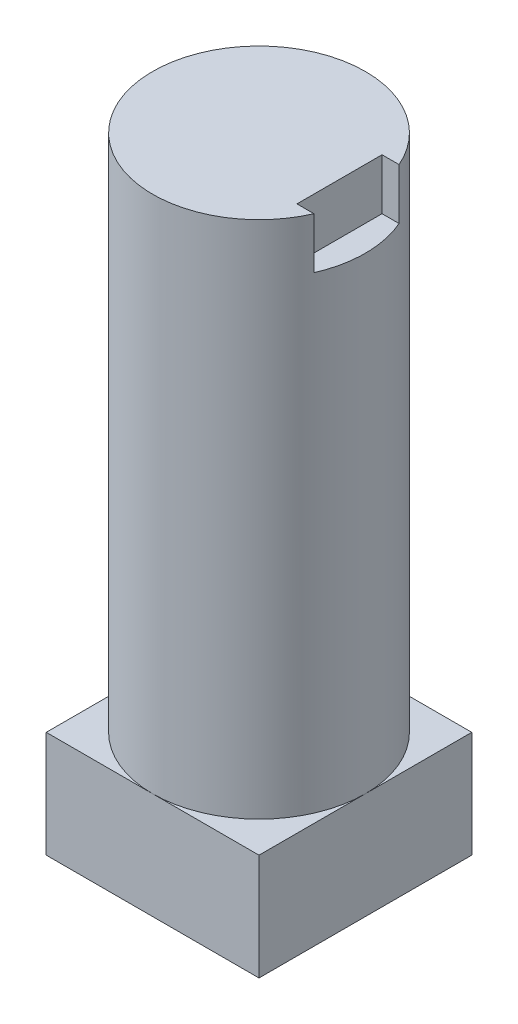
ISO-10303-21;
HEADER;
FILE_DESCRIPTION(('STEP AP214'),'2;1');
FILE_NAME('part.step','',(''),(''),'','','');
FILE_SCHEMA(('AUTOMOTIVE_DESIGN { 1 0 10303 214 1 1 1 1 }'));
ENDSEC;
DATA;
#1=APPLICATION_CONTEXT('core data for automotive mechanical design processes');
#2=APPLICATION_PROTOCOL_DEFINITION('international standard','automotive_design',2000,#1);
#3=PRODUCT_CONTEXT('',#1,'mechanical');
#4=PRODUCT('Part','Part','',(#3));
#5=PRODUCT_RELATED_PRODUCT_CATEGORY('part','',(#4));
#6=PRODUCT_DEFINITION_FORMATION('','',#4);
#7=PRODUCT_DEFINITION_CONTEXT('part definition',#1,'design');
#8=PRODUCT_DEFINITION('design','',#6,#7);
#9=PRODUCT_DEFINITION_SHAPE('','',#8);
#10=(LENGTH_UNIT() NAMED_UNIT(*) SI_UNIT(.MILLI.,.METRE.));
#11=(NAMED_UNIT(*) PLANE_ANGLE_UNIT() SI_UNIT($,.RADIAN.));
#12=(NAMED_UNIT(*) SI_UNIT($,.STERADIAN.) SOLID_ANGLE_UNIT());
#13=UNCERTAINTY_MEASURE_WITH_UNIT(LENGTH_MEASURE(1.E-05),#10,'distance_accuracy_value','');
#14=(GEOMETRIC_REPRESENTATION_CONTEXT(3) GLOBAL_UNCERTAINTY_ASSIGNED_CONTEXT((#13)) GLOBAL_UNIT_ASSIGNED_CONTEXT((#10,
#11,#12)) REPRESENTATION_CONTEXT('',''));
#15=CARTESIAN_POINT('',(0.,0.,0.));
#16=DIRECTION('',(0.,0.,1.));
#17=DIRECTION('',(1.,0.,0.));
#18=AXIS2_PLACEMENT_3D('',#15,#16,#17);
#19=CARTESIAN_POINT('',(-34.9241184124081,14.312388078501,22.3609994216903));
#20=DIRECTION('',(0.,-1.,0.));
#21=DIRECTION('',(0.,0.,-1.));
#22=AXIS2_PLACEMENT_3D('',#19,#20,#21);
#23=CYLINDRICAL_SURFACE('',#22,2.5);
#24=CARTESIAN_POINT('',(-34.9241184124081,-3.28761192149899,22.3609994216903));
#25=DIRECTION('',(0.,1.,0.));
#26=DIRECTION('',(0.,0.,1.));
#27=AXIS2_PLACEMENT_3D('',#24,#25,#26);
#28=CIRCLE('',#27,2.5);
#29=CARTESIAN_POINT('',(-34.9241184124081,-3.28761192149899,24.8609994216903));
#30=VERTEX_POINT('',#29);
#31=CARTESIAN_POINT('',(-32.4241184124081,-3.28761192149899,22.3609994216903));
#32=VERTEX_POINT('',#31);
#33=EDGE_CURVE('E144',#30,#32,#28,.T.);
#34=ORIENTED_EDGE('',*,*,#33,.T.);
#35=CARTESIAN_POINT('',(-34.9241184124081,-3.28761192149899,19.8609994216903));
#36=VERTEX_POINT('',#35);
#37=EDGE_CURVE('E52',#32,#36,#28,.T.);
#38=ORIENTED_EDGE('',*,*,#37,.T.);
#39=CARTESIAN_POINT('',(-37.4241184124081,-3.28761192149899,22.3609994216903));
#40=VERTEX_POINT('',#39);
#41=EDGE_CURVE('E184',#36,#40,#28,.T.);
#42=ORIENTED_EDGE('',*,*,#41,.T.);
#43=EDGE_CURVE('E66',#40,#30,#28,.T.);
#44=ORIENTED_EDGE('',*,*,#43,.T.);
#45=EDGE_LOOP('',(#34,#38,#42,#44));
#46=FACE_BOUND('',#45,.T.);
#47=CARTESIAN_POINT('',(-34.9241184124081,8.91238807850102,22.3609994216903));
#48=DIRECTION('',(0.,1.,0.));
#49=DIRECTION('',(0.,0.,1.));
#50=AXIS2_PLACEMENT_3D('',#47,#48,#49);
#51=CIRCLE('',#50,2.5);
#52=CARTESIAN_POINT('',(-32.6328305649302,8.91238807850102,23.3609994216903));
#53=VERTEX_POINT('',#52);
#54=CARTESIAN_POINT('',(-32.6328305649302,8.91238807850102,21.3609994216903));
#55=VERTEX_POINT('',#54);
#56=EDGE_CURVE('E120',#53,#55,#51,.F.);
#57=ORIENTED_EDGE('',*,*,#56,.T.);
#58=DIRECTION('',(0.,1.,0.));
#59=VECTOR('',#58,1.);
#60=CARTESIAN_POINT('',(-32.6328305649302,7.71238807850101,21.3609994216903));
#61=LINE('',#60,#59);
#62=CARTESIAN_POINT('',(-32.6328305649302,7.71238807850101,21.3609994216903));
#63=VERTEX_POINT('',#62);
#64=EDGE_CURVE('E129',#63,#55,#61,.T.);
#65=ORIENTED_EDGE('',*,*,#64,.F.);
#66=CARTESIAN_POINT('',(-34.9241184124081,7.71238807850101,22.3609994216903));
#67=DIRECTION('',(0.,1.,0.));
#68=DIRECTION('',(0.,0.,1.));
#69=AXIS2_PLACEMENT_3D('',#66,#67,#68);
#70=CIRCLE('',#69,2.5);
#71=CARTESIAN_POINT('',(-32.6328305649302,7.71238807850101,23.3609994216903));
#72=VERTEX_POINT('',#71);
#73=EDGE_CURVE('E375',#72,#63,#70,.T.);
#74=ORIENTED_EDGE('',*,*,#73,.F.);
#75=DIRECTION('',(0.,1.,0.));
#76=VECTOR('',#75,1.);
#77=CARTESIAN_POINT('',(-32.6328305649302,7.71238807850101,23.3609994216903));
#78=LINE('',#77,#76);
#79=EDGE_CURVE('E130',#72,#53,#78,.T.);
#80=ORIENTED_EDGE('',*,*,#79,.T.);
#81=EDGE_LOOP('',(#57,#65,#74,#80));
#82=FACE_BOUND('',#81,.T.);
#83=ADVANCED_FACE('F44',(#46,#82),#23,.T.);
#84=CARTESIAN_POINT('',(-30.3076921273144,7.71238807850101,23.3609994216903));
#85=DIRECTION('',(0.,0.,-1.));
#86=DIRECTION('',(-1.,0.,0.));
#87=AXIS2_PLACEMENT_3D('',#84,#85,#86);
#88=PLANE('',#87);
#89=DIRECTION('',(0.,1.,0.));
#90=VECTOR('',#89,1.);
#91=CARTESIAN_POINT('',(-33.0328305649302,7.71238807850101,23.3609994216903));
#92=LINE('',#91,#90);
#93=CARTESIAN_POINT('',(-33.0328305649302,7.71238807850101,23.3609994216903));
#94=VERTEX_POINT('',#93);
#95=CARTESIAN_POINT('',(-33.0328305649302,8.91238807850101,23.3609994216903));
#96=VERTEX_POINT('',#95);
#97=EDGE_CURVE('E138',#94,#96,#92,.T.);
#98=ORIENTED_EDGE('',*,*,#97,.T.);
#99=DIRECTION('',(1.,0.,0.));
#100=VECTOR('',#99,1.);
#101=CARTESIAN_POINT('',(-30.3076921273144,8.91238807850101,23.3609994216903));
#102=LINE('',#101,#100);
#103=EDGE_CURVE('E379',#96,#53,#102,.T.);
#104=ORIENTED_EDGE('',*,*,#103,.T.);
#105=ORIENTED_EDGE('',*,*,#79,.F.);
#106=DIRECTION('',(-1.,0.,0.));
#107=VECTOR('',#106,1.);
#108=CARTESIAN_POINT('',(-30.3076921273144,7.71238807850101,23.3609994216903));
#109=LINE('',#108,#107);
#110=EDGE_CURVE('E374',#72,#94,#109,.T.);
#111=ORIENTED_EDGE('',*,*,#110,.T.);
#112=EDGE_LOOP('',(#98,#104,#105,#111));
#113=FACE_BOUND('',#112,.T.);
#114=ADVANCED_FACE('F228',(#113),#88,.T.);
#115=CARTESIAN_POINT('',(-33.0328305649302,7.71238807850101,7.79325973955173));
#116=DIRECTION('',(-1.,0.,0.));
#117=DIRECTION('',(0.,0.,1.));
#118=AXIS2_PLACEMENT_3D('',#115,#116,#117);
#119=PLANE('',#118);
#120=DIRECTION('',(0.,0.,-1.));
#121=VECTOR('',#120,1.);
#122=CARTESIAN_POINT('',(-33.0328305649302,8.91238807850101,7.79325973955173));
#123=LINE('',#122,#121);
#124=CARTESIAN_POINT('',(-33.0328305649302,8.91238807850101,21.3609994216903));
#125=VERTEX_POINT('',#124);
#126=EDGE_CURVE('E58',#96,#125,#123,.T.);
#127=ORIENTED_EDGE('',*,*,#126,.F.);
#128=ORIENTED_EDGE('',*,*,#97,.F.);
#129=DIRECTION('',(0.,0.,1.));
#130=VECTOR('',#129,1.);
#131=CARTESIAN_POINT('',(-33.0328305649302,7.71238807850101,7.79325973955173));
#132=LINE('',#131,#130);
#133=CARTESIAN_POINT('',(-33.0328305649302,7.71238807850101,21.3609994216903));
#134=VERTEX_POINT('',#133);
#135=EDGE_CURVE('E140',#134,#94,#132,.T.);
#136=ORIENTED_EDGE('',*,*,#135,.F.);
#137=DIRECTION('',(0.,1.,0.));
#138=VECTOR('',#137,1.);
#139=CARTESIAN_POINT('',(-33.0328305649302,7.71238807850101,21.3609994216903));
#140=LINE('',#139,#138);
#141=EDGE_CURVE('E136',#134,#125,#140,.T.);
#142=ORIENTED_EDGE('',*,*,#141,.T.);
#143=EDGE_LOOP('',(#127,#128,#136,#142));
#144=FACE_BOUND('',#143,.T.);
#145=ADVANCED_FACE('F232',(#144),#119,.F.);
#146=CARTESIAN_POINT('',(-30.3076921273144,7.71238807850101,21.3609994216903));
#147=DIRECTION('',(0.,0.,-1.));
#148=DIRECTION('',(-1.,0.,0.));
#149=AXIS2_PLACEMENT_3D('',#146,#147,#148);
#150=PLANE('',#149);
#151=DIRECTION('',(1.,0.,0.));
#152=VECTOR('',#151,1.);
#153=CARTESIAN_POINT('',(-30.3076921273144,8.91238807850101,21.3609994216903));
#154=LINE('',#153,#152);
#155=EDGE_CURVE('E13',#125,#55,#154,.T.);
#156=ORIENTED_EDGE('',*,*,#155,.F.);
#157=ORIENTED_EDGE('',*,*,#141,.F.);
#158=DIRECTION('',(-1.,0.,0.));
#159=VECTOR('',#158,1.);
#160=CARTESIAN_POINT('',(-30.3076921273144,7.71238807850101,21.3609994216903));
#161=LINE('',#160,#159);
#162=EDGE_CURVE('E134',#63,#134,#161,.T.);
#163=ORIENTED_EDGE('',*,*,#162,.F.);
#164=ORIENTED_EDGE('',*,*,#64,.T.);
#165=EDGE_LOOP('',(#156,#157,#163,#164));
#166=FACE_BOUND('',#165,.T.);
#167=ADVANCED_FACE('F132',(#166),#150,.F.);
#168=CARTESIAN_POINT('',(-34.9241184124081,-3.28761192149899,22.3609994216903));
#169=DIRECTION('',(0.,1.,0.));
#170=DIRECTION('',(0.,0.,1.));
#171=AXIS2_PLACEMENT_3D('',#168,#169,#170);
#172=PLANE('',#171);
#173=ORIENTED_EDGE('',*,*,#33,.F.);
#174=DIRECTION('',(1.,0.,0.));
#175=VECTOR('',#174,1.);
#176=CARTESIAN_POINT('',(-37.4241184124081,-3.28761192149899,24.8609994216903));
#177=LINE('',#176,#175);
#178=CARTESIAN_POINT('',(-32.4241184124081,-3.28761192149899,24.8609994216903));
#179=VERTEX_POINT('',#178);
#180=EDGE_CURVE('E151',#30,#179,#177,.T.);
#181=ORIENTED_EDGE('',*,*,#180,.T.);
#182=DIRECTION('',(0.,0.,-1.));
#183=VECTOR('',#182,1.);
#184=CARTESIAN_POINT('',(-32.4241184124081,-3.28761192149899,24.8609994216903));
#185=LINE('',#184,#183);
#186=EDGE_CURVE('E152',#179,#32,#185,.T.);
#187=ORIENTED_EDGE('',*,*,#186,.T.);
#188=EDGE_LOOP('',(#173,#181,#187));
#189=FACE_BOUND('',#188,.T.);
#190=ADVANCED_FACE('F197',(#189),#172,.T.);
#191=ORIENTED_EDGE('',*,*,#37,.F.);
#192=CARTESIAN_POINT('',(-32.4241184124081,-3.28761192149899,19.8609994216903));
#193=VERTEX_POINT('',#192);
#194=EDGE_CURVE('E150',#32,#193,#185,.T.);
#195=ORIENTED_EDGE('',*,*,#194,.T.);
#196=DIRECTION('',(1.,0.,0.));
#197=VECTOR('',#196,1.);
#198=CARTESIAN_POINT('',(-37.4241184124081,-3.28761192149899,19.8609994216903));
#199=LINE('',#198,#197);
#200=EDGE_CURVE('E155',#36,#193,#199,.T.);
#201=ORIENTED_EDGE('',*,*,#200,.F.);
#202=EDGE_LOOP('',(#191,#195,#201));
#203=FACE_BOUND('',#202,.T.);
#204=ADVANCED_FACE('F193',(#203),#172,.T.);
#205=ORIENTED_EDGE('',*,*,#41,.F.);
#206=CARTESIAN_POINT('',(-37.4241184124081,-3.28761192149899,19.8609994216903));
#207=VERTEX_POINT('',#206);
#208=EDGE_CURVE('E156',#207,#36,#199,.T.);
#209=ORIENTED_EDGE('',*,*,#208,.F.);
#210=DIRECTION('',(0.,0.,-1.));
#211=VECTOR('',#210,1.);
#212=CARTESIAN_POINT('',(-37.4241184124081,-3.28761192149899,24.8609994216903));
#213=LINE('',#212,#211);
#214=EDGE_CURVE('E159',#40,#207,#213,.T.);
#215=ORIENTED_EDGE('',*,*,#214,.F.);
#216=EDGE_LOOP('',(#205,#209,#215));
#217=FACE_BOUND('',#216,.T.);
#218=ADVANCED_FACE('F213',(#217),#172,.T.);
#219=CARTESIAN_POINT('',(-37.4241184124081,-3.28761192149899,24.8609994216903));
#220=DIRECTION('',(0.,0.,-1.));
#221=DIRECTION('',(-1.,0.,0.));
#222=AXIS2_PLACEMENT_3D('',#219,#220,#221);
#223=PLANE('',#222);
#224=DIRECTION('',(1.,0.,0.));
#225=VECTOR('',#224,1.);
#226=CARTESIAN_POINT('',(-37.4241184124081,-5.78761192149899,24.8609994216903));
#227=LINE('',#226,#225);
#228=CARTESIAN_POINT('',(-37.4241184124081,-5.78761192149899,24.8609994216903));
#229=VERTEX_POINT('',#228);
#230=CARTESIAN_POINT('',(-32.4241184124081,-5.78761192149899,24.8609994216903));
#231=VERTEX_POINT('',#230);
#232=EDGE_CURVE('E147',#229,#231,#227,.T.);
#233=ORIENTED_EDGE('',*,*,#232,.T.);
#234=DIRECTION('',(0.,-1.,0.));
#235=VECTOR('',#234,1.);
#236=CARTESIAN_POINT('',(-32.4241184124081,-3.28761192149899,24.8609994216903));
#237=LINE('',#236,#235);
#238=EDGE_CURVE('E179',#179,#231,#237,.T.);
#239=ORIENTED_EDGE('',*,*,#238,.F.);
#240=ORIENTED_EDGE('',*,*,#180,.F.);
#241=CARTESIAN_POINT('',(-37.4241184124081,-3.28761192149899,24.8609994216903));
#242=VERTEX_POINT('',#241);
#243=EDGE_CURVE('E148',#242,#30,#177,.T.);
#244=ORIENTED_EDGE('',*,*,#243,.F.);
#245=DIRECTION('',(0.,-1.,0.));
#246=VECTOR('',#245,1.);
#247=CARTESIAN_POINT('',(-37.4241184124081,-3.28761192149899,24.8609994216903));
#248=LINE('',#247,#246);
#249=EDGE_CURVE('E163',#242,#229,#248,.T.);
#250=ORIENTED_EDGE('',*,*,#249,.T.);
#251=EDGE_LOOP('',(#233,#239,#240,#244,#250));
#252=FACE_BOUND('',#251,.T.);
#253=ADVANCED_FACE('F46',(#252),#223,.F.);
#254=CARTESIAN_POINT('',(-32.4241184124081,-3.28761192149899,24.8609994216903));
#255=DIRECTION('',(-1.,0.,0.));
#256=DIRECTION('',(0.,0.,1.));
#257=AXIS2_PLACEMENT_3D('',#254,#255,#256);
#258=PLANE('',#257);
#259=DIRECTION('',(0.,0.,-1.));
#260=VECTOR('',#259,1.);
#261=CARTESIAN_POINT('',(-32.4241184124081,-5.78761192149899,24.8609994216903));
#262=LINE('',#261,#260);
#263=CARTESIAN_POINT('',(-32.4241184124081,-5.78761192149899,19.8609994216903));
#264=VERTEX_POINT('',#263);
#265=EDGE_CURVE('E166',#231,#264,#262,.T.);
#266=ORIENTED_EDGE('',*,*,#265,.T.);
#267=DIRECTION('',(0.,-1.,0.));
#268=VECTOR('',#267,1.);
#269=CARTESIAN_POINT('',(-32.4241184124081,-3.28761192149899,19.8609994216903));
#270=LINE('',#269,#268);
#271=EDGE_CURVE('E178',#193,#264,#270,.T.);
#272=ORIENTED_EDGE('',*,*,#271,.F.);
#273=ORIENTED_EDGE('',*,*,#194,.F.);
#274=ORIENTED_EDGE('',*,*,#186,.F.);
#275=ORIENTED_EDGE('',*,*,#238,.T.);
#276=EDGE_LOOP('',(#266,#272,#273,#274,#275));
#277=FACE_BOUND('',#276,.T.);
#278=ADVANCED_FACE('F195',(#277),#258,.F.);
#279=CARTESIAN_POINT('',(-37.4241184124081,-3.28761192149899,19.8609994216903));
#280=DIRECTION('',(0.,0.,-1.));
#281=DIRECTION('',(-1.,0.,0.));
#282=AXIS2_PLACEMENT_3D('',#279,#280,#281);
#283=PLANE('',#282);
#284=DIRECTION('',(1.,0.,0.));
#285=VECTOR('',#284,1.);
#286=CARTESIAN_POINT('',(-37.4241184124081,-5.78761192149899,19.8609994216903));
#287=LINE('',#286,#285);
#288=CARTESIAN_POINT('',(-37.4241184124081,-5.78761192149899,19.8609994216903));
#289=VERTEX_POINT('',#288);
#290=EDGE_CURVE('E169',#289,#264,#287,.T.);
#291=ORIENTED_EDGE('',*,*,#290,.F.);
#292=DIRECTION('',(0.,-1.,0.));
#293=VECTOR('',#292,1.);
#294=CARTESIAN_POINT('',(-37.4241184124081,-3.28761192149899,19.8609994216903));
#295=LINE('',#294,#293);
#296=EDGE_CURVE('E176',#207,#289,#295,.T.);
#297=ORIENTED_EDGE('',*,*,#296,.F.);
#298=ORIENTED_EDGE('',*,*,#208,.T.);
#299=ORIENTED_EDGE('',*,*,#200,.T.);
#300=ORIENTED_EDGE('',*,*,#271,.T.);
#301=EDGE_LOOP('',(#291,#297,#298,#299,#300));
#302=FACE_BOUND('',#301,.T.);
#303=ADVANCED_FACE('F211',(#302),#283,.T.);
#304=CARTESIAN_POINT('',(-37.4241184124081,-3.28761192149899,24.8609994216903));
#305=DIRECTION('',(-1.,0.,0.));
#306=DIRECTION('',(0.,0.,1.));
#307=AXIS2_PLACEMENT_3D('',#304,#305,#306);
#308=PLANE('',#307);
#309=DIRECTION('',(0.,0.,-1.));
#310=VECTOR('',#309,1.);
#311=CARTESIAN_POINT('',(-37.4241184124081,-5.78761192149899,24.8609994216903));
#312=LINE('',#311,#310);
#313=EDGE_CURVE('E172',#229,#289,#312,.T.);
#314=ORIENTED_EDGE('',*,*,#313,.F.);
#315=ORIENTED_EDGE('',*,*,#249,.F.);
#316=EDGE_CURVE('E160',#242,#40,#213,.T.);
#317=ORIENTED_EDGE('',*,*,#316,.T.);
#318=ORIENTED_EDGE('',*,*,#214,.T.);
#319=ORIENTED_EDGE('',*,*,#296,.T.);
#320=EDGE_LOOP('',(#314,#315,#317,#318,#319));
#321=FACE_BOUND('',#320,.T.);
#322=ADVANCED_FACE('F206',(#321),#308,.T.);
#323=ORIENTED_EDGE('',*,*,#43,.F.);
#324=ORIENTED_EDGE('',*,*,#316,.F.);
#325=ORIENTED_EDGE('',*,*,#243,.T.);
#326=EDGE_LOOP('',(#323,#324,#325));
#327=FACE_BOUND('',#326,.T.);
#328=ADVANCED_FACE('F214',(#327),#172,.T.);
#329=CARTESIAN_POINT('',(-34.9241184124081,-5.78761192149899,22.3609994216903));
#330=DIRECTION('',(0.,1.,0.));
#331=DIRECTION('',(0.,0.,1.));
#332=AXIS2_PLACEMENT_3D('',#329,#330,#331);
#333=PLANE('',#332);
#334=ORIENTED_EDGE('',*,*,#232,.F.);
#335=ORIENTED_EDGE('',*,*,#313,.T.);
#336=ORIENTED_EDGE('',*,*,#290,.T.);
#337=ORIENTED_EDGE('',*,*,#265,.F.);
#338=EDGE_LOOP('',(#334,#335,#336,#337));
#339=FACE_BOUND('',#338,.T.);
#340=ADVANCED_FACE('F204',(#339),#333,.F.);
#341=CARTESIAN_POINT('',(-30.3076921273144,7.71238807850101,7.79325973955173));
#342=DIRECTION('',(0.,1.,0.));
#343=DIRECTION('',(0.,0.,1.));
#344=AXIS2_PLACEMENT_3D('',#341,#342,#343);
#345=PLANE('',#344);
#346=ORIENTED_EDGE('',*,*,#110,.F.);
#347=ORIENTED_EDGE('',*,*,#73,.T.);
#348=ORIENTED_EDGE('',*,*,#162,.T.);
#349=ORIENTED_EDGE('',*,*,#135,.T.);
#350=EDGE_LOOP('',(#346,#347,#348,#349));
#351=FACE_BOUND('',#350,.T.);
#352=ADVANCED_FACE('F221',(#351),#345,.T.);
#353=CARTESIAN_POINT('',(-34.9241184124081,8.91238807850101,22.3609994216903));
#354=DIRECTION('',(0.,1.,0.));
#355=DIRECTION('',(0.,0.,1.));
#356=AXIS2_PLACEMENT_3D('',#353,#354,#355);
#357=PLANE('',#356);
#358=ORIENTED_EDGE('',*,*,#126,.T.);
#359=ORIENTED_EDGE('',*,*,#155,.T.);
#360=ORIENTED_EDGE('',*,*,#56,.F.);
#361=ORIENTED_EDGE('',*,*,#103,.F.);
#362=EDGE_LOOP('',(#358,#359,#360,#361));
#363=FACE_BOUND('',#362,.T.);
#364=ADVANCED_FACE('F119',(#363),#357,.T.);
#365=CLOSED_SHELL('',(#83,#114,#145,#167,#190,#204,#218,#253,#278,#303,#322,#328,#340,#352,#364));
#366=MANIFOLD_SOLID_BREP('B2',#365);
#367=ADVANCED_BREP_SHAPE_REPRESENTATION('',(#18,#366),#14);
#368=SHAPE_DEFINITION_REPRESENTATION(#9,#367);
ENDSEC;
END-ISO-10303-21;
